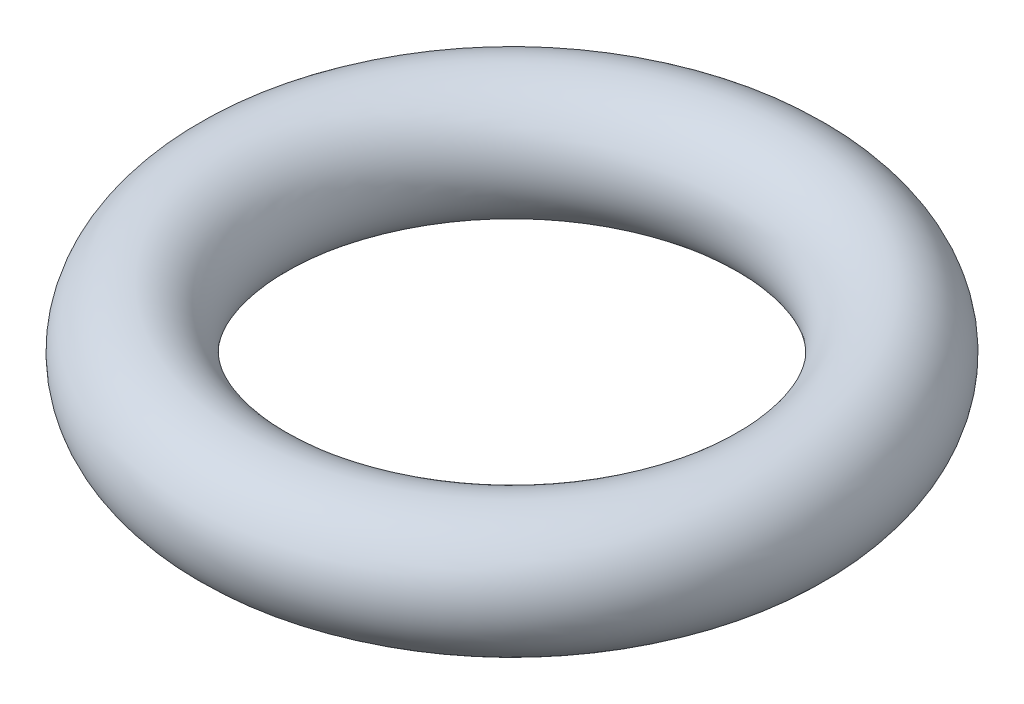
ISO-10303-21;
HEADER;
FILE_DESCRIPTION(('STEP AP214'),'2;1');
FILE_NAME('part.step','',(''),(''),'','','');
FILE_SCHEMA(('AUTOMOTIVE_DESIGN { 1 0 10303 214 1 1 1 1 }'));
ENDSEC;
DATA;
#1=APPLICATION_CONTEXT('core data for automotive mechanical design processes');
#2=APPLICATION_PROTOCOL_DEFINITION('international standard','automotive_design',2000,#1);
#3=PRODUCT_CONTEXT('',#1,'mechanical');
#4=PRODUCT('Part','Part','',(#3));
#5=PRODUCT_RELATED_PRODUCT_CATEGORY('part','',(#4));
#6=PRODUCT_DEFINITION_FORMATION('','',#4);
#7=PRODUCT_DEFINITION_CONTEXT('part definition',#1,'design');
#8=PRODUCT_DEFINITION('design','',#6,#7);
#9=PRODUCT_DEFINITION_SHAPE('','',#8);
#10=(LENGTH_UNIT() NAMED_UNIT(*) SI_UNIT(.MILLI.,.METRE.));
#11=(NAMED_UNIT(*) PLANE_ANGLE_UNIT() SI_UNIT($,.RADIAN.));
#12=(NAMED_UNIT(*) SI_UNIT($,.STERADIAN.) SOLID_ANGLE_UNIT());
#13=UNCERTAINTY_MEASURE_WITH_UNIT(LENGTH_MEASURE(1.E-05),#10,'distance_accuracy_value','');
#14=(GEOMETRIC_REPRESENTATION_CONTEXT(3) GLOBAL_UNCERTAINTY_ASSIGNED_CONTEXT((#13)) GLOBAL_UNIT_ASSIGNED_CONTEXT((#10,
#11,#12)) REPRESENTATION_CONTEXT('',''));
#15=CARTESIAN_POINT('',(0.,0.,0.));
#16=DIRECTION('',(0.,0.,1.));
#17=DIRECTION('',(1.,0.,0.));
#18=AXIS2_PLACEMENT_3D('',#15,#16,#17);
#19=CARTESIAN_POINT('',(0.,0.,3.925));
#20=DIRECTION('',(0.,1.,0.));
#21=DIRECTION('',(0.,0.,1.));
#22=AXIS2_PLACEMENT_3D('',#19,#20,#21);
#23=TOROIDAL_SURFACE('',#22,3.925,0.89);
#24=CARTESIAN_POINT('',(0.,0.,8.74));
#25=VERTEX_POINT('',#24);
#26=VERTEX_LOOP('',#25);
#27=FACE_BOUND('',#26,.T.);
#28=ADVANCED_FACE('F30',(#27),#23,.T.);
#29=CLOSED_SHELL('',(#28));
#30=MANIFOLD_SOLID_BREP('B2',#29);
#31=ADVANCED_BREP_SHAPE_REPRESENTATION('',(#18,#30),#14);
#32=SHAPE_DEFINITION_REPRESENTATION(#9,#31);
ENDSEC;
END-ISO-10303-21;
